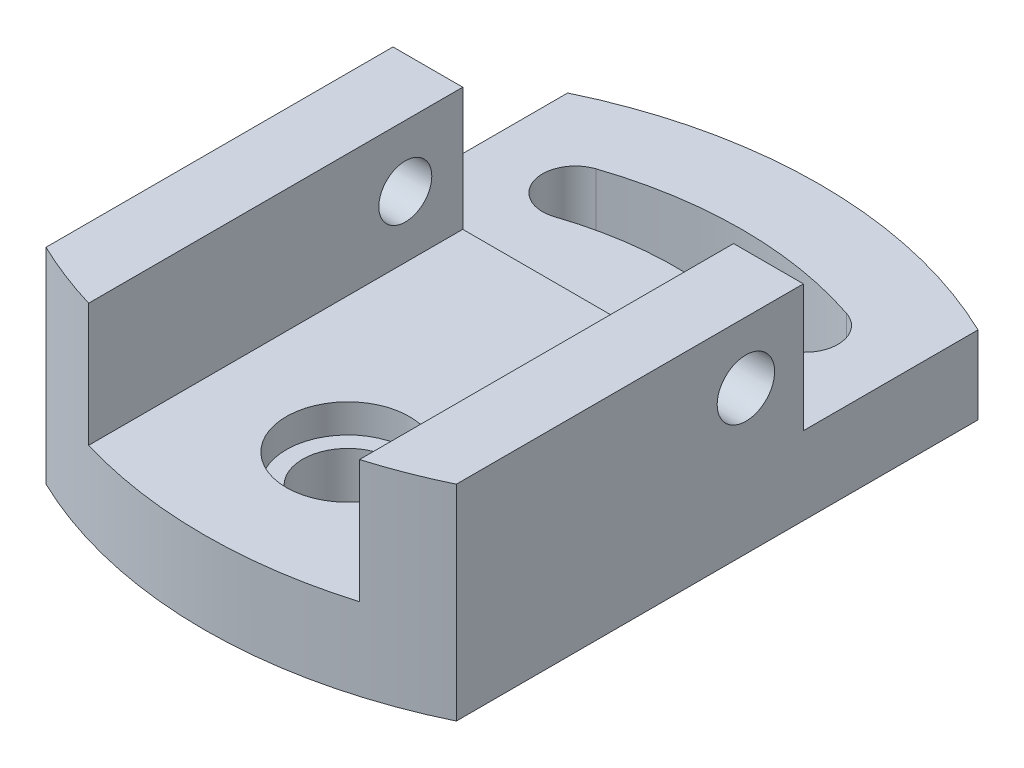
ISO-10303-21;
HEADER;
FILE_DESCRIPTION(('STEP AP214'),'2;1');
FILE_NAME('part.step','',(''),(''),'','','');
FILE_SCHEMA(('AUTOMOTIVE_DESIGN { 1 0 10303 214 1 1 1 1 }'));
ENDSEC;
DATA;
#1=APPLICATION_CONTEXT('core data for automotive mechanical design processes');
#2=APPLICATION_PROTOCOL_DEFINITION('international standard','automotive_design',2000,#1);
#3=PRODUCT_CONTEXT('',#1,'mechanical');
#4=PRODUCT('Part','Part','',(#3));
#5=PRODUCT_RELATED_PRODUCT_CATEGORY('part','',(#4));
#6=PRODUCT_DEFINITION_FORMATION('','',#4);
#7=PRODUCT_DEFINITION_CONTEXT('part definition',#1,'design');
#8=PRODUCT_DEFINITION('design','',#6,#7);
#9=PRODUCT_DEFINITION_SHAPE('','',#8);
#10=(LENGTH_UNIT() NAMED_UNIT(*) SI_UNIT(.MILLI.,.METRE.));
#11=(NAMED_UNIT(*) PLANE_ANGLE_UNIT() SI_UNIT($,.RADIAN.));
#12=(NAMED_UNIT(*) SI_UNIT($,.STERADIAN.) SOLID_ANGLE_UNIT());
#13=UNCERTAINTY_MEASURE_WITH_UNIT(LENGTH_MEASURE(1.E-05),#10,'distance_accuracy_value','');
#14=(GEOMETRIC_REPRESENTATION_CONTEXT(3) GLOBAL_UNCERTAINTY_ASSIGNED_CONTEXT((#13)) GLOBAL_UNIT_ASSIGNED_CONTEXT((#10,
#11,#12)) REPRESENTATION_CONTEXT('',''));
#15=CARTESIAN_POINT('',(0.,0.,0.));
#16=DIRECTION('',(0.,0.,1.));
#17=DIRECTION('',(1.,0.,0.));
#18=AXIS2_PLACEMENT_3D('',#15,#16,#17);
#19=CARTESIAN_POINT('',(-50.,50.,0.));
#20=DIRECTION('',(1.,0.,0.));
#21=DIRECTION('',(0.,0.,-1.));
#22=AXIS2_PLACEMENT_3D('',#19,#20,#21);
#23=PLANE('',#22);
#24=CARTESIAN_POINT('',(-50.,35.,-47.));
#25=DIRECTION('',(-1.,0.,0.));
#26=DIRECTION('',(0.,0.,1.));
#27=AXIS2_PLACEMENT_3D('',#24,#25,#26);
#28=CIRCLE('',#27,6.34);
#29=CARTESIAN_POINT('',(-50.,35.,-40.66));
#30=VERTEX_POINT('',#29);
#31=EDGE_CURVE('E307',#30,#30,#28,.T.);
#32=ORIENTED_EDGE('',*,*,#31,.F.);
#33=EDGE_LOOP('',(#32));
#34=FACE_BOUND('',#33,.T.);
#35=DIRECTION('',(0.,0.,1.));
#36=VECTOR('',#35,1.);
#37=CARTESIAN_POINT('',(-50.,0.,0.));
#38=LINE('',#37,#36);
#39=CARTESIAN_POINT('',(-50.,0.,-103.56157588604));
#40=VERTEX_POINT('',#39);
#41=CARTESIAN_POINT('',(-50.,0.,23.5615758860399));
#42=VERTEX_POINT('',#41);
#43=EDGE_CURVE('E242',#40,#42,#38,.T.);
#44=ORIENTED_EDGE('',*,*,#43,.T.);
#45=DIRECTION('',(0.,-1.,0.));
#46=VECTOR('',#45,1.);
#47=CARTESIAN_POINT('',(-50.,50.,23.5615758860399));
#48=LINE('',#47,#46);
#49=CARTESIAN_POINT('',(-50.,50.,23.5615758860399));
#50=VERTEX_POINT('',#49);
#51=EDGE_CURVE('E47',#50,#42,#48,.T.);
#52=ORIENTED_EDGE('',*,*,#51,.F.);
#53=DIRECTION('',(0.,0.,1.));
#54=VECTOR('',#53,1.);
#55=CARTESIAN_POINT('',(-50.,50.,0.));
#56=LINE('',#55,#54);
#57=CARTESIAN_POINT('',(-50.,50.,-61.));
#58=VERTEX_POINT('',#57);
#59=EDGE_CURVE('E243',#58,#50,#56,.T.);
#60=ORIENTED_EDGE('',*,*,#59,.F.);
#61=DIRECTION('',(0.,-1.,0.));
#62=VECTOR('',#61,1.);
#63=CARTESIAN_POINT('',(-50.,50.,-61.));
#64=LINE('',#63,#62);
#65=CARTESIAN_POINT('',(-50.,19.,-61.));
#66=VERTEX_POINT('',#65);
#67=EDGE_CURVE('E157',#58,#66,#64,.T.);
#68=ORIENTED_EDGE('',*,*,#67,.T.);
#69=DIRECTION('',(0.,0.,1.));
#70=VECTOR('',#69,1.);
#71=CARTESIAN_POINT('',(-50.,19.,0.));
#72=LINE('',#71,#70);
#73=CARTESIAN_POINT('',(-50.,19.,-103.56157588604));
#74=VERTEX_POINT('',#73);
#75=EDGE_CURVE('E54',#74,#66,#72,.T.);
#76=ORIENTED_EDGE('',*,*,#75,.F.);
#77=DIRECTION('',(0.,-1.,0.));
#78=VECTOR('',#77,1.);
#79=CARTESIAN_POINT('',(-50.,19.,-103.56157588604));
#80=LINE('',#79,#78);
#81=EDGE_CURVE('E142',#74,#40,#80,.T.);
#82=ORIENTED_EDGE('',*,*,#81,.T.);
#83=EDGE_LOOP('',(#44,#52,#60,#68,#76,#82));
#84=FACE_BOUND('',#83,.T.);
#85=ADVANCED_FACE('F40',(#34,#84),#23,.F.);
#86=CARTESIAN_POINT('',(0.,50.,-80.));
#87=DIRECTION('',(0.,-1.,0.));
#88=DIRECTION('',(0.,0.,-1.));
#89=AXIS2_PLACEMENT_3D('',#86,#87,#88);
#90=CYLINDRICAL_SURFACE('',#89,115.);
#91=CARTESIAN_POINT('',(0.,0.,-80.));
#92=DIRECTION('',(0.,1.,0.));
#93=DIRECTION('',(0.,0.,1.));
#94=AXIS2_PLACEMENT_3D('',#91,#92,#93);
#95=CIRCLE('',#94,115.);
#96=CARTESIAN_POINT('',(50.,0.,23.5615758860399));
#97=VERTEX_POINT('',#96);
#98=EDGE_CURVE('E247',#42,#97,#95,.T.);
#99=ORIENTED_EDGE('',*,*,#98,.T.);
#100=DIRECTION('',(0.,-1.,0.));
#101=VECTOR('',#100,1.);
#102=CARTESIAN_POINT('',(50.,50.,23.5615758860399));
#103=LINE('',#102,#101);
#104=CARTESIAN_POINT('',(50.,50.,23.5615758860399));
#105=VERTEX_POINT('',#104);
#106=EDGE_CURVE('E224',#105,#97,#103,.T.);
#107=ORIENTED_EDGE('',*,*,#106,.F.);
#108=CARTESIAN_POINT('',(0.,50.,-80.));
#109=DIRECTION('',(0.,1.,0.));
#110=DIRECTION('',(0.,0.,1.));
#111=AXIS2_PLACEMENT_3D('',#108,#109,#110);
#112=CIRCLE('',#111,115.);
#113=CARTESIAN_POINT('',(33.,50.,30.1635148313633));
#114=VERTEX_POINT('',#113);
#115=EDGE_CURVE('E208',#114,#105,#112,.T.);
#116=ORIENTED_EDGE('',*,*,#115,.F.);
#117=DIRECTION('',(0.,-1.,0.));
#118=VECTOR('',#117,1.);
#119=CARTESIAN_POINT('',(33.,50.,30.1635148313633));
#120=LINE('',#119,#118);
#121=CARTESIAN_POINT('',(33.,20.,30.1635148313633));
#122=VERTEX_POINT('',#121);
#123=EDGE_CURVE('E227',#114,#122,#120,.T.);
#124=ORIENTED_EDGE('',*,*,#123,.T.);
#125=CARTESIAN_POINT('',(0.,20.,-80.));
#126=DIRECTION('',(0.,1.,0.));
#127=DIRECTION('',(0.,0.,1.));
#128=AXIS2_PLACEMENT_3D('',#125,#126,#127);
#129=CIRCLE('',#128,115.);
#130=CARTESIAN_POINT('',(-33.,20.,30.1635148313633));
#131=VERTEX_POINT('',#130);
#132=EDGE_CURVE('E234',#131,#122,#129,.T.);
#133=ORIENTED_EDGE('',*,*,#132,.F.);
#134=DIRECTION('',(0.,-1.,0.));
#135=VECTOR('',#134,1.);
#136=CARTESIAN_POINT('',(-33.,50.,30.1635148313633));
#137=LINE('',#136,#135);
#138=CARTESIAN_POINT('',(-33.,50.,30.1635148313633));
#139=VERTEX_POINT('',#138);
#140=EDGE_CURVE('E259',#139,#131,#137,.T.);
#141=ORIENTED_EDGE('',*,*,#140,.F.);
#142=CARTESIAN_POINT('',(0.,50.,-80.));
#143=DIRECTION('',(0.,1.,0.));
#144=DIRECTION('',(0.,0.,1.));
#145=AXIS2_PLACEMENT_3D('',#142,#143,#144);
#146=CIRCLE('',#145,115.);
#147=EDGE_CURVE('E246',#50,#139,#146,.T.);
#148=ORIENTED_EDGE('',*,*,#147,.F.);
#149=ORIENTED_EDGE('',*,*,#51,.T.);
#150=EDGE_LOOP('',(#99,#107,#116,#124,#133,#141,#148,#149));
#151=FACE_BOUND('',#150,.T.);
#152=ADVANCED_FACE('F263',(#151),#90,.T.);
#153=CARTESIAN_POINT('',(-33.,50.,0.));
#154=DIRECTION('',(1.,0.,0.));
#155=DIRECTION('',(0.,0.,-1.));
#156=AXIS2_PLACEMENT_3D('',#153,#154,#155);
#157=PLANE('',#156);
#158=CARTESIAN_POINT('',(-33.,35.,-47.));
#159=DIRECTION('',(1.,0.,0.));
#160=DIRECTION('',(0.,0.,-1.));
#161=AXIS2_PLACEMENT_3D('',#158,#159,#160);
#162=CIRCLE('',#161,6.4522);
#163=CARTESIAN_POINT('',(-33.,35.,-53.4522));
#164=VERTEX_POINT('',#163);
#165=EDGE_CURVE('E313',#164,#164,#162,.F.);
#166=ORIENTED_EDGE('',*,*,#165,.T.);
#167=EDGE_LOOP('',(#166));
#168=FACE_BOUND('',#167,.T.);
#169=DIRECTION('',(0.,0.,1.));
#170=VECTOR('',#169,1.);
#171=CARTESIAN_POINT('',(-33.,20.,0.));
#172=LINE('',#171,#170);
#173=CARTESIAN_POINT('',(-33.,20.,-61.));
#174=VERTEX_POINT('',#173);
#175=EDGE_CURVE('E62',#174,#131,#172,.T.);
#176=ORIENTED_EDGE('',*,*,#175,.F.);
#177=DIRECTION('',(0.,-1.,0.));
#178=VECTOR('',#177,1.);
#179=CARTESIAN_POINT('',(-33.,50.,-61.));
#180=LINE('',#179,#178);
#181=CARTESIAN_POINT('',(-33.,50.,-61.));
#182=VERTEX_POINT('',#181);
#183=EDGE_CURVE('E257',#182,#174,#180,.T.);
#184=ORIENTED_EDGE('',*,*,#183,.F.);
#185=DIRECTION('',(0.,0.,1.));
#186=VECTOR('',#185,1.);
#187=CARTESIAN_POINT('',(-33.,50.,0.));
#188=LINE('',#187,#186);
#189=EDGE_CURVE('E249',#182,#139,#188,.T.);
#190=ORIENTED_EDGE('',*,*,#189,.T.);
#191=ORIENTED_EDGE('',*,*,#140,.T.);
#192=EDGE_LOOP('',(#176,#184,#190,#191));
#193=FACE_BOUND('',#192,.T.);
#194=ADVANCED_FACE('F287',(#168,#193),#157,.T.);
#195=CARTESIAN_POINT('',(0.,50.,-61.));
#196=DIRECTION('',(0.,0.,1.));
#197=DIRECTION('',(1.,0.,0.));
#198=AXIS2_PLACEMENT_3D('',#195,#196,#197);
#199=PLANE('',#198);
#200=DIRECTION('',(0.,-1.,0.));
#201=VECTOR('',#200,1.);
#202=CARTESIAN_POINT('',(50.,50.,-61.));
#203=LINE('',#202,#201);
#204=CARTESIAN_POINT('',(50.,50.,-61.));
#205=VERTEX_POINT('',#204);
#206=CARTESIAN_POINT('',(50.,19.,-61.));
#207=VERTEX_POINT('',#206);
#208=EDGE_CURVE('E221',#205,#207,#203,.T.);
#209=ORIENTED_EDGE('',*,*,#208,.T.);
#210=DIRECTION('',(-1.,0.,0.));
#211=VECTOR('',#210,1.);
#212=CARTESIAN_POINT('',(0.,19.,-61.));
#213=LINE('',#212,#211);
#214=EDGE_CURVE('E158',#207,#66,#213,.T.);
#215=ORIENTED_EDGE('',*,*,#214,.T.);
#216=ORIENTED_EDGE('',*,*,#67,.F.);
#217=DIRECTION('',(-1.,0.,0.));
#218=VECTOR('',#217,1.);
#219=CARTESIAN_POINT('',(0.,50.,-61.));
#220=LINE('',#219,#218);
#221=EDGE_CURVE('E252',#182,#58,#220,.T.);
#222=ORIENTED_EDGE('',*,*,#221,.F.);
#223=ORIENTED_EDGE('',*,*,#183,.T.);
#224=DIRECTION('',(1.,0.,0.));
#225=VECTOR('',#224,1.);
#226=CARTESIAN_POINT('',(0.,20.,-61.));
#227=LINE('',#226,#225);
#228=CARTESIAN_POINT('',(33.,20.,-61.));
#229=VERTEX_POINT('',#228);
#230=EDGE_CURVE('E239',#174,#229,#227,.T.);
#231=ORIENTED_EDGE('',*,*,#230,.T.);
#232=DIRECTION('',(0.,-1.,0.));
#233=VECTOR('',#232,1.);
#234=CARTESIAN_POINT('',(33.,50.,-61.));
#235=LINE('',#234,#233);
#236=CARTESIAN_POINT('',(33.,50.,-61.));
#237=VERTEX_POINT('',#236);
#238=EDGE_CURVE('E216',#237,#229,#235,.T.);
#239=ORIENTED_EDGE('',*,*,#238,.F.);
#240=DIRECTION('',(1.,0.,0.));
#241=VECTOR('',#240,1.);
#242=CARTESIAN_POINT('',(0.,50.,-61.));
#243=LINE('',#242,#241);
#244=EDGE_CURVE('E213',#237,#205,#243,.T.);
#245=ORIENTED_EDGE('',*,*,#244,.T.);
#246=EDGE_LOOP('',(#209,#215,#216,#222,#223,#231,#239,#245));
#247=FACE_BOUND('',#246,.T.);
#248=ADVANCED_FACE('F284',(#247),#199,.F.);
#249=CARTESIAN_POINT('',(0.,50.,0.));
#250=DIRECTION('',(0.,1.,0.));
#251=DIRECTION('',(0.,0.,1.));
#252=AXIS2_PLACEMENT_3D('',#249,#250,#251);
#253=PLANE('',#252);
#254=ORIENTED_EDGE('',*,*,#59,.T.);
#255=ORIENTED_EDGE('',*,*,#147,.T.);
#256=ORIENTED_EDGE('',*,*,#189,.F.);
#257=ORIENTED_EDGE('',*,*,#221,.T.);
#258=EDGE_LOOP('',(#254,#255,#256,#257));
#259=FACE_BOUND('',#258,.T.);
#260=ADVANCED_FACE('F289',(#259),#253,.T.);
#261=CARTESIAN_POINT('',(0.,0.,0.));
#262=DIRECTION('',(0.,1.,0.));
#263=DIRECTION('',(0.,0.,1.));
#264=AXIS2_PLACEMENT_3D('',#261,#262,#263);
#265=PLANE('',#264);
#266=ORIENTED_EDGE('',*,*,#43,.F.);
#267=CARTESIAN_POINT('',(0.,0.,0.));
#268=DIRECTION('',(0.,1.,0.));
#269=DIRECTION('',(0.,0.,1.));
#270=AXIS2_PLACEMENT_3D('',#267,#268,#269);
#271=CIRCLE('',#270,115.);
#272=CARTESIAN_POINT('',(50.,0.,-103.56157588604));
#273=VERTEX_POINT('',#272);
#274=EDGE_CURVE('E148',#40,#273,#271,.F.);
#275=ORIENTED_EDGE('',*,*,#274,.T.);
#276=DIRECTION('',(0.,0.,1.));
#277=VECTOR('',#276,1.);
#278=CARTESIAN_POINT('',(50.,0.,0.));
#279=LINE('',#278,#277);
#280=EDGE_CURVE('E203',#273,#97,#279,.T.);
#281=ORIENTED_EDGE('',*,*,#280,.T.);
#282=ORIENTED_EDGE('',*,*,#98,.F.);
#283=EDGE_LOOP('',(#266,#275,#281,#282));
#284=FACE_BOUND('',#283,.T.);
#285=CARTESIAN_POINT('',(-28.,0.,-83.4266144584568));
#286=DIRECTION('',(0.,1.,0.));
#287=DIRECTION('',(0.,0.,1.));
#288=AXIS2_PLACEMENT_3D('',#285,#286,#287);
#289=CIRCLE('',#288,8.00000000000002);
#290=CARTESIAN_POINT('',(-30.5454545454545,0.,-91.0108521364984));
#291=VERTEX_POINT('',#290);
#292=CARTESIAN_POINT('',(-25.4545454545454,0.,-75.8423767804153));
#293=VERTEX_POINT('',#292);
#294=EDGE_CURVE('E187',#291,#293,#289,.T.);
#295=ORIENTED_EDGE('',*,*,#294,.T.);
#296=CARTESIAN_POINT('',(0.,0.,3.05311331771918E-13));
#297=DIRECTION('',(0.,1.,0.));
#298=DIRECTION('',(0.,0.,1.));
#299=AXIS2_PLACEMENT_3D('',#296,#297,#298);
#300=CIRCLE('',#299,80.0000000000003);
#301=CARTESIAN_POINT('',(25.4545454545455,0.,-75.8423767804153));
#302=VERTEX_POINT('',#301);
#303=EDGE_CURVE('E164',#302,#293,#300,.T.);
#304=ORIENTED_EDGE('',*,*,#303,.F.);
#305=CARTESIAN_POINT('',(28.,0.,-83.4266144584568));
#306=DIRECTION('',(0.,1.,0.));
#307=DIRECTION('',(0.,0.,1.));
#308=AXIS2_PLACEMENT_3D('',#305,#306,#307);
#309=CIRCLE('',#308,8.00000000000002);
#310=CARTESIAN_POINT('',(30.5454545454546,0.,-91.0108521364984));
#311=VERTEX_POINT('',#310);
#312=EDGE_CURVE('E167',#302,#311,#309,.T.);
#313=ORIENTED_EDGE('',*,*,#312,.T.);
#314=CARTESIAN_POINT('',(0.,0.,3.05311331771918E-13));
#315=DIRECTION('',(0.,1.,0.));
#316=DIRECTION('',(0.,0.,1.));
#317=AXIS2_PLACEMENT_3D('',#314,#315,#316);
#318=CIRCLE('',#317,96.0000000000003);
#319=EDGE_CURVE('E191',#311,#291,#318,.T.);
#320=ORIENTED_EDGE('',*,*,#319,.T.);
#321=EDGE_LOOP('',(#295,#304,#313,#320));
#322=FACE_BOUND('',#321,.T.);
#323=CARTESIAN_POINT('',(0.,0.,0.));
#324=DIRECTION('',(0.,1.,0.));
#325=DIRECTION('',(0.,0.,1.));
#326=AXIS2_PLACEMENT_3D('',#323,#324,#325);
#327=CIRCLE('',#326,11.);
#328=CARTESIAN_POINT('',(0.,0.,-11.));
#329=VERTEX_POINT('',#328);
#330=EDGE_CURVE('E170',#329,#329,#327,.T.);
#331=ORIENTED_EDGE('',*,*,#330,.T.);
#332=EDGE_LOOP('',(#331));
#333=FACE_BOUND('',#332,.T.);
#334=ADVANCED_FACE('F267',(#284,#322,#333),#265,.F.);
#335=CARTESIAN_POINT('',(0.,20.,0.));
#336=DIRECTION('',(0.,-1.,0.));
#337=DIRECTION('',(0.,0.,-1.));
#338=AXIS2_PLACEMENT_3D('',#335,#336,#337);
#339=CYLINDRICAL_SURFACE('',#338,15.);
#340=CARTESIAN_POINT('',(0.,13.,0.));
#341=DIRECTION('',(0.,1.,0.));
#342=DIRECTION('',(0.,0.,1.));
#343=AXIS2_PLACEMENT_3D('',#340,#341,#342);
#344=CIRCLE('',#343,15.);
#345=CARTESIAN_POINT('',(0.,13.,15.));
#346=VERTEX_POINT('',#345);
#347=EDGE_CURVE('E11',#346,#346,#344,.T.);
#348=ORIENTED_EDGE('',*,*,#347,.F.);
#349=EDGE_LOOP('',(#348));
#350=FACE_BOUND('',#349,.T.);
#351=CARTESIAN_POINT('',(0.,20.,0.));
#352=DIRECTION('',(0.,1.,0.));
#353=DIRECTION('',(0.,0.,1.));
#354=AXIS2_PLACEMENT_3D('',#351,#352,#353);
#355=CIRCLE('',#354,15.);
#356=CARTESIAN_POINT('',(0.,20.,15.));
#357=VERTEX_POINT('',#356);
#358=EDGE_CURVE('E230',#357,#357,#355,.T.);
#359=ORIENTED_EDGE('',*,*,#358,.T.);
#360=EDGE_LOOP('',(#359));
#361=FACE_BOUND('',#360,.T.);
#362=ADVANCED_FACE('F296',(#350,#361),#339,.F.);
#363=CARTESIAN_POINT('',(0.,20.,0.));
#364=DIRECTION('',(0.,1.,0.));
#365=DIRECTION('',(0.,0.,1.));
#366=AXIS2_PLACEMENT_3D('',#363,#364,#365);
#367=PLANE('',#366);
#368=ORIENTED_EDGE('',*,*,#358,.F.);
#369=EDGE_LOOP('',(#368));
#370=FACE_BOUND('',#369,.T.);
#371=ORIENTED_EDGE('',*,*,#175,.T.);
#372=ORIENTED_EDGE('',*,*,#132,.T.);
#373=DIRECTION('',(0.,0.,1.));
#374=VECTOR('',#373,1.);
#375=CARTESIAN_POINT('',(33.,20.,0.));
#376=LINE('',#375,#374);
#377=EDGE_CURVE('E236',#229,#122,#376,.T.);
#378=ORIENTED_EDGE('',*,*,#377,.F.);
#379=ORIENTED_EDGE('',*,*,#230,.F.);
#380=EDGE_LOOP('',(#371,#372,#378,#379));
#381=FACE_BOUND('',#380,.T.);
#382=ADVANCED_FACE('F282',(#370,#381),#367,.T.);
#383=CARTESIAN_POINT('',(33.,50.,0.));
#384=DIRECTION('',(1.,0.,0.));
#385=DIRECTION('',(0.,0.,-1.));
#386=AXIS2_PLACEMENT_3D('',#383,#384,#385);
#387=PLANE('',#386);
#388=CARTESIAN_POINT('',(33.,35.,-47.));
#389=DIRECTION('',(1.,0.,0.));
#390=DIRECTION('',(0.,0.,-1.));
#391=AXIS2_PLACEMENT_3D('',#388,#389,#390);
#392=CIRCLE('',#391,6.8878);
#393=CARTESIAN_POINT('',(33.,35.,-53.8878));
#394=VERTEX_POINT('',#393);
#395=EDGE_CURVE('E309',#394,#394,#392,.F.);
#396=ORIENTED_EDGE('',*,*,#395,.F.);
#397=EDGE_LOOP('',(#396));
#398=FACE_BOUND('',#397,.T.);
#399=ORIENTED_EDGE('',*,*,#238,.T.);
#400=ORIENTED_EDGE('',*,*,#377,.T.);
#401=ORIENTED_EDGE('',*,*,#123,.F.);
#402=DIRECTION('',(0.,0.,1.));
#403=VECTOR('',#402,1.);
#404=CARTESIAN_POINT('',(33.,50.,0.));
#405=LINE('',#404,#403);
#406=EDGE_CURVE('E205',#237,#114,#405,.T.);
#407=ORIENTED_EDGE('',*,*,#406,.F.);
#408=EDGE_LOOP('',(#399,#400,#401,#407));
#409=FACE_BOUND('',#408,.T.);
#410=ADVANCED_FACE('F279',(#398,#409),#387,.F.);
#411=CARTESIAN_POINT('',(50.,50.,0.));
#412=DIRECTION('',(1.,0.,0.));
#413=DIRECTION('',(0.,0.,-1.));
#414=AXIS2_PLACEMENT_3D('',#411,#412,#413);
#415=PLANE('',#414);
#416=CARTESIAN_POINT('',(50.,35.,-47.));
#417=DIRECTION('',(-1.,0.,0.));
#418=DIRECTION('',(0.,0.,1.));
#419=AXIS2_PLACEMENT_3D('',#416,#417,#418);
#420=CIRCLE('',#419,7.);
#421=CARTESIAN_POINT('',(50.,35.,-40.));
#422=VERTEX_POINT('',#421);
#423=EDGE_CURVE('E310',#422,#422,#420,.T.);
#424=ORIENTED_EDGE('',*,*,#423,.T.);
#425=EDGE_LOOP('',(#424));
#426=FACE_BOUND('',#425,.T.);
#427=ORIENTED_EDGE('',*,*,#280,.F.);
#428=DIRECTION('',(0.,-1.,0.));
#429=VECTOR('',#428,1.);
#430=CARTESIAN_POINT('',(50.,19.,-103.56157588604));
#431=LINE('',#430,#429);
#432=CARTESIAN_POINT('',(50.,19.,-103.56157588604));
#433=VERTEX_POINT('',#432);
#434=EDGE_CURVE('E152',#433,#273,#431,.T.);
#435=ORIENTED_EDGE('',*,*,#434,.F.);
#436=DIRECTION('',(0.,0.,1.));
#437=VECTOR('',#436,1.);
#438=CARTESIAN_POINT('',(50.,19.,0.));
#439=LINE('',#438,#437);
#440=EDGE_CURVE('E163',#433,#207,#439,.T.);
#441=ORIENTED_EDGE('',*,*,#440,.T.);
#442=ORIENTED_EDGE('',*,*,#208,.F.);
#443=DIRECTION('',(0.,0.,1.));
#444=VECTOR('',#443,1.);
#445=CARTESIAN_POINT('',(50.,50.,0.));
#446=LINE('',#445,#444);
#447=EDGE_CURVE('E210',#205,#105,#446,.T.);
#448=ORIENTED_EDGE('',*,*,#447,.T.);
#449=ORIENTED_EDGE('',*,*,#106,.T.);
#450=EDGE_LOOP('',(#427,#435,#441,#442,#448,#449));
#451=FACE_BOUND('',#450,.T.);
#452=ADVANCED_FACE('F270',(#426,#451),#415,.T.);
#453=CARTESIAN_POINT('',(0.,50.,0.));
#454=DIRECTION('',(0.,1.,0.));
#455=DIRECTION('',(0.,0.,1.));
#456=AXIS2_PLACEMENT_3D('',#453,#454,#455);
#457=PLANE('',#456);
#458=ORIENTED_EDGE('',*,*,#406,.T.);
#459=ORIENTED_EDGE('',*,*,#115,.T.);
#460=ORIENTED_EDGE('',*,*,#447,.F.);
#461=ORIENTED_EDGE('',*,*,#244,.F.);
#462=EDGE_LOOP('',(#458,#459,#460,#461));
#463=FACE_BOUND('',#462,.T.);
#464=ADVANCED_FACE('F277',(#463),#457,.T.);
#465=CARTESIAN_POINT('',(-28.,19.,-83.4266144584568));
#466=DIRECTION('',(0.,-1.,0.));
#467=DIRECTION('',(0.,0.,-1.));
#468=AXIS2_PLACEMENT_3D('',#465,#466,#467);
#469=CYLINDRICAL_SURFACE('',#468,8.00000000000002);
#470=ORIENTED_EDGE('',*,*,#294,.F.);
#471=DIRECTION('',(0.,-1.,0.));
#472=VECTOR('',#471,1.);
#473=CARTESIAN_POINT('',(-30.5454545454545,19.,-91.0108521364984));
#474=LINE('',#473,#472);
#475=CARTESIAN_POINT('',(-30.5454545454545,19.,-91.0108521364984));
#476=VERTEX_POINT('',#475);
#477=EDGE_CURVE('E201',#476,#291,#474,.T.);
#478=ORIENTED_EDGE('',*,*,#477,.F.);
#479=CARTESIAN_POINT('',(-28.,19.,-83.4266144584568));
#480=DIRECTION('',(0.,1.,0.));
#481=DIRECTION('',(0.,0.,1.));
#482=AXIS2_PLACEMENT_3D('',#479,#480,#481);
#483=CIRCLE('',#482,8.00000000000002);
#484=CARTESIAN_POINT('',(-25.4545454545454,19.,-75.8423767804153));
#485=VERTEX_POINT('',#484);
#486=EDGE_CURVE('E175',#476,#485,#483,.T.);
#487=ORIENTED_EDGE('',*,*,#486,.T.);
#488=DIRECTION('',(0.,-1.,0.));
#489=VECTOR('',#488,1.);
#490=CARTESIAN_POINT('',(-25.4545454545454,19.,-75.8423767804153));
#491=LINE('',#490,#489);
#492=EDGE_CURVE('E151',#485,#293,#491,.T.);
#493=ORIENTED_EDGE('',*,*,#492,.T.);
#494=EDGE_LOOP('',(#470,#478,#487,#493));
#495=FACE_BOUND('',#494,.T.);
#496=ADVANCED_FACE('F351',(#495),#469,.F.);
#497=CARTESIAN_POINT('',(0.,19.,3.05311331771918E-13));
#498=DIRECTION('',(0.,-1.,0.));
#499=DIRECTION('',(0.,0.,-1.));
#500=AXIS2_PLACEMENT_3D('',#497,#498,#499);
#501=CYLINDRICAL_SURFACE('',#500,96.0000000000003);
#502=ORIENTED_EDGE('',*,*,#319,.F.);
#503=DIRECTION('',(0.,-1.,0.));
#504=VECTOR('',#503,1.);
#505=CARTESIAN_POINT('',(30.5454545454546,19.,-91.0108521364984));
#506=LINE('',#505,#504);
#507=CARTESIAN_POINT('',(30.5454545454546,19.,-91.0108521364984));
#508=VERTEX_POINT('',#507);
#509=EDGE_CURVE('E199',#508,#311,#506,.T.);
#510=ORIENTED_EDGE('',*,*,#509,.F.);
#511=CARTESIAN_POINT('',(0.,19.,3.05311331771918E-13));
#512=DIRECTION('',(0.,1.,0.));
#513=DIRECTION('',(0.,0.,1.));
#514=AXIS2_PLACEMENT_3D('',#511,#512,#513);
#515=CIRCLE('',#514,96.0000000000003);
#516=EDGE_CURVE('E178',#508,#476,#515,.T.);
#517=ORIENTED_EDGE('',*,*,#516,.T.);
#518=ORIENTED_EDGE('',*,*,#477,.T.);
#519=EDGE_LOOP('',(#502,#510,#517,#518));
#520=FACE_BOUND('',#519,.T.);
#521=ADVANCED_FACE('F347',(#520),#501,.F.);
#522=CARTESIAN_POINT('',(28.,19.,-83.4266144584568));
#523=DIRECTION('',(0.,-1.,0.));
#524=DIRECTION('',(0.,0.,-1.));
#525=AXIS2_PLACEMENT_3D('',#522,#523,#524);
#526=CYLINDRICAL_SURFACE('',#525,8.00000000000002);
#527=ORIENTED_EDGE('',*,*,#312,.F.);
#528=DIRECTION('',(0.,-1.,0.));
#529=VECTOR('',#528,1.);
#530=CARTESIAN_POINT('',(25.4545454545455,19.,-75.8423767804153));
#531=LINE('',#530,#529);
#532=CARTESIAN_POINT('',(25.4545454545455,19.,-75.8423767804153));
#533=VERTEX_POINT('',#532);
#534=EDGE_CURVE('E197',#533,#302,#531,.T.);
#535=ORIENTED_EDGE('',*,*,#534,.F.);
#536=CARTESIAN_POINT('',(28.,19.,-83.4266144584568));
#537=DIRECTION('',(0.,1.,0.));
#538=DIRECTION('',(0.,0.,1.));
#539=AXIS2_PLACEMENT_3D('',#536,#537,#538);
#540=CIRCLE('',#539,8.00000000000002);
#541=EDGE_CURVE('E181',#533,#508,#540,.T.);
#542=ORIENTED_EDGE('',*,*,#541,.T.);
#543=ORIENTED_EDGE('',*,*,#509,.T.);
#544=EDGE_LOOP('',(#527,#535,#542,#543));
#545=FACE_BOUND('',#544,.T.);
#546=ADVANCED_FACE('F344',(#545),#526,.F.);
#547=CARTESIAN_POINT('',(0.,19.,0.));
#548=DIRECTION('',(0.,-1.,0.));
#549=DIRECTION('',(0.,0.,-1.));
#550=AXIS2_PLACEMENT_3D('',#547,#548,#549);
#551=CYLINDRICAL_SURFACE('',#550,115.);
#552=ORIENTED_EDGE('',*,*,#274,.F.);
#553=ORIENTED_EDGE('',*,*,#81,.F.);
#554=CARTESIAN_POINT('',(0.,19.,0.));
#555=DIRECTION('',(0.,1.,0.));
#556=DIRECTION('',(0.,0.,1.));
#557=AXIS2_PLACEMENT_3D('',#554,#555,#556);
#558=CIRCLE('',#557,115.);
#559=EDGE_CURVE('E145',#74,#433,#558,.F.);
#560=ORIENTED_EDGE('',*,*,#559,.T.);
#561=ORIENTED_EDGE('',*,*,#434,.T.);
#562=EDGE_LOOP('',(#552,#553,#560,#561));
#563=FACE_BOUND('',#562,.T.);
#564=ADVANCED_FACE('F143',(#563),#551,.T.);
#565=CARTESIAN_POINT('',(0.,19.,3.05311331771918E-13));
#566=DIRECTION('',(0.,-1.,0.));
#567=DIRECTION('',(0.,0.,-1.));
#568=AXIS2_PLACEMENT_3D('',#565,#566,#567);
#569=CYLINDRICAL_SURFACE('',#568,80.0000000000003);
#570=ORIENTED_EDGE('',*,*,#303,.T.);
#571=ORIENTED_EDGE('',*,*,#492,.F.);
#572=CARTESIAN_POINT('',(0.,19.,3.05311331771918E-13));
#573=DIRECTION('',(0.,1.,0.));
#574=DIRECTION('',(0.,0.,1.));
#575=AXIS2_PLACEMENT_3D('',#572,#573,#574);
#576=CIRCLE('',#575,80.0000000000003);
#577=EDGE_CURVE('E184',#533,#485,#576,.T.);
#578=ORIENTED_EDGE('',*,*,#577,.F.);
#579=ORIENTED_EDGE('',*,*,#534,.T.);
#580=EDGE_LOOP('',(#570,#571,#578,#579));
#581=FACE_BOUND('',#580,.T.);
#582=ADVANCED_FACE('F337',(#581),#569,.T.);
#583=CARTESIAN_POINT('',(0.,19.,0.));
#584=DIRECTION('',(0.,1.,0.));
#585=DIRECTION('',(0.,0.,1.));
#586=AXIS2_PLACEMENT_3D('',#583,#584,#585);
#587=PLANE('',#586);
#588=ORIENTED_EDGE('',*,*,#559,.F.);
#589=ORIENTED_EDGE('',*,*,#75,.T.);
#590=ORIENTED_EDGE('',*,*,#214,.F.);
#591=ORIENTED_EDGE('',*,*,#440,.F.);
#592=EDGE_LOOP('',(#588,#589,#590,#591));
#593=FACE_BOUND('',#592,.T.);
#594=ORIENTED_EDGE('',*,*,#486,.F.);
#595=ORIENTED_EDGE('',*,*,#516,.F.);
#596=ORIENTED_EDGE('',*,*,#541,.F.);
#597=ORIENTED_EDGE('',*,*,#577,.T.);
#598=EDGE_LOOP('',(#594,#595,#596,#597));
#599=FACE_BOUND('',#598,.T.);
#600=ADVANCED_FACE('F160',(#593,#599),#587,.T.);
#601=CARTESIAN_POINT('',(0.,13.,0.));
#602=DIRECTION('',(0.,-1.,0.));
#603=DIRECTION('',(0.,0.,-1.));
#604=AXIS2_PLACEMENT_3D('',#601,#602,#603);
#605=CYLINDRICAL_SURFACE('',#604,11.);
#606=CARTESIAN_POINT('',(0.,13.,0.));
#607=DIRECTION('',(0.,1.,0.));
#608=DIRECTION('',(0.,0.,1.));
#609=AXIS2_PLACEMENT_3D('',#606,#607,#608);
#610=CIRCLE('',#609,11.);
#611=CARTESIAN_POINT('',(0.,13.,-11.));
#612=VERTEX_POINT('',#611);
#613=EDGE_CURVE('E188',#612,#612,#610,.T.);
#614=CARTESIAN_POINT('',(0.,13.,-11.));
#615=CARTESIAN_POINT('',(0.,12.8645833333333,-11.));
#616=CARTESIAN_POINT('',(0.,12.7291666666667,-11.));
#617=CARTESIAN_POINT('',(0.,12.4583333333333,-11.));
#618=CARTESIAN_POINT('',(0.,12.3229166666667,-11.));
#619=CARTESIAN_POINT('',(0.,12.0520833333333,-11.));
#620=CARTESIAN_POINT('',(0.,11.9166666666667,-11.));
#621=CARTESIAN_POINT('',(0.,11.6458333333333,-11.));
#622=CARTESIAN_POINT('',(0.,11.5104166666667,-11.));
#623=CARTESIAN_POINT('',(0.,11.2395833333333,-11.));
#624=CARTESIAN_POINT('',(0.,11.1041666666667,-11.));
#625=CARTESIAN_POINT('',(0.,10.8333333333333,-11.));
#626=CARTESIAN_POINT('',(0.,10.6979166666667,-11.));
#627=CARTESIAN_POINT('',(0.,10.4270833333333,-11.));
#628=CARTESIAN_POINT('',(0.,10.2916666666667,-11.));
#629=CARTESIAN_POINT('',(0.,10.0208333333333,-11.));
#630=CARTESIAN_POINT('',(0.,9.88541666666667,-11.));
#631=CARTESIAN_POINT('',(0.,9.61458333333333,-11.));
#632=CARTESIAN_POINT('',(0.,9.47916666666667,-11.));
#633=CARTESIAN_POINT('',(0.,9.20833333333333,-11.));
#634=CARTESIAN_POINT('',(0.,9.07291666666666,-11.));
#635=CARTESIAN_POINT('',(0.,8.80208333333333,-11.));
#636=CARTESIAN_POINT('',(0.,8.66666666666667,-11.));
#637=CARTESIAN_POINT('',(0.,8.39583333333333,-11.));
#638=CARTESIAN_POINT('',(0.,8.26041666666667,-11.));
#639=CARTESIAN_POINT('',(0.,7.98958333333333,-11.));
#640=CARTESIAN_POINT('',(0.,7.85416666666667,-11.));
#641=CARTESIAN_POINT('',(0.,7.58333333333333,-11.));
#642=CARTESIAN_POINT('',(0.,7.44791666666667,-11.));
#643=CARTESIAN_POINT('',(0.,7.17708333333333,-11.));
#644=CARTESIAN_POINT('',(0.,7.04166666666667,-11.));
#645=CARTESIAN_POINT('',(0.,6.77083333333333,-11.));
#646=CARTESIAN_POINT('',(0.,6.63541666666667,-11.));
#647=CARTESIAN_POINT('',(0.,6.36458333333333,-11.));
#648=CARTESIAN_POINT('',(0.,6.22916666666667,-11.));
#649=CARTESIAN_POINT('',(0.,5.95833333333333,-11.));
#650=CARTESIAN_POINT('',(0.,5.82291666666667,-11.));
#651=CARTESIAN_POINT('',(0.,5.55208333333333,-11.));
#652=CARTESIAN_POINT('',(0.,5.41666666666667,-11.));
#653=CARTESIAN_POINT('',(0.,5.14583333333333,-11.));
#654=CARTESIAN_POINT('',(0.,5.01041666666667,-11.));
#655=CARTESIAN_POINT('',(0.,4.73958333333333,-11.));
#656=CARTESIAN_POINT('',(0.,4.60416666666667,-11.));
#657=CARTESIAN_POINT('',(0.,4.33333333333333,-11.));
#658=CARTESIAN_POINT('',(0.,4.19791666666667,-11.));
#659=CARTESIAN_POINT('',(0.,3.92708333333333,-11.));
#660=CARTESIAN_POINT('',(0.,3.79166666666667,-11.));
#661=CARTESIAN_POINT('',(0.,3.52083333333333,-11.));
#662=CARTESIAN_POINT('',(0.,3.38541666666667,-11.));
#663=CARTESIAN_POINT('',(0.,3.11458333333333,-11.));
#664=CARTESIAN_POINT('',(0.,2.97916666666667,-11.));
#665=CARTESIAN_POINT('',(0.,2.70833333333333,-11.));
#666=CARTESIAN_POINT('',(0.,2.57291666666667,-11.));
#667=CARTESIAN_POINT('',(0.,2.30208333333333,-11.));
#668=CARTESIAN_POINT('',(0.,2.16666666666667,-11.));
#669=CARTESIAN_POINT('',(0.,1.89583333333333,-11.));
#670=CARTESIAN_POINT('',(0.,1.76041666666667,-11.));
#671=CARTESIAN_POINT('',(0.,1.48958333333333,-11.));
#672=CARTESIAN_POINT('',(0.,1.35416666666667,-11.));
#673=CARTESIAN_POINT('',(0.,1.08333333333333,-11.));
#674=CARTESIAN_POINT('',(0.,0.947916666666667,-11.));
#675=CARTESIAN_POINT('',(0.,0.677083333333334,-11.));
#676=CARTESIAN_POINT('',(0.,0.541666666666667,-11.));
#677=CARTESIAN_POINT('',(0.,0.270833333333334,-11.));
#678=CARTESIAN_POINT('',(0.,0.135416666666667,-11.));
#679=CARTESIAN_POINT('',(0.,0.,-11.));
#680=B_SPLINE_CURVE_WITH_KNOTS('',3,(#614,#615,#616,#617,#618,#619,#620,#621,#622,#623,#624,
#625,#626,#627,#628,#629,#630,#631,#632,#633,#634,#635,#636,#637,#638,#639,#640,#641,#642,#643,
#644,#645,#646,#647,#648,#649,#650,#651,#652,#653,#654,#655,#656,#657,#658,#659,#660,#661,#662,
#663,#664,#665,#666,#667,#668,#669,#670,#671,#672,#673,#674,#675,#676,#677,#678,#679),
.UNSPECIFIED.,.F.,.F.,(4,2,2,2,2,2,2,2,2,2,2,2,2,2,2,2,2,2,2,2,2,2,2,2,2,2,2,2,2,2,2,2,4),(0.,
0.40625,0.812500000000001,1.21875,1.625,2.03125,2.4375,2.84375,3.25,3.65625,4.0625,4.46875,
4.875,5.28125,5.6875,6.09375,6.5,6.90625,7.3125,7.71875,8.125,8.53125,8.9375,9.34375,9.75,
10.15625,10.5625,10.96875,11.375,11.78125,12.1875,12.59375,13.),.UNSPECIFIED.);
#681=EDGE_CURVE('BSEAM326',#612,#329,#680,.T.);
#682=ORIENTED_EDGE('',*,*,#613,.T.);
#683=ORIENTED_EDGE('',*,*,#330,.F.);
#684=ORIENTED_EDGE('',*,*,#681,.T.);
#685=ORIENTED_EDGE('',*,*,#681,.F.);
#686=EDGE_LOOP('',(#682,#684,#683,#685));
#687=FACE_BOUND('',#686,.T.);
#688=ADVANCED_FACE('F326',(#687),#605,.F.);
#689=CARTESIAN_POINT('',(0.,13.,0.));
#690=DIRECTION('',(0.,1.,0.));
#691=DIRECTION('',(0.,0.,1.));
#692=AXIS2_PLACEMENT_3D('',#689,#690,#691);
#693=PLANE('',#692);
#694=ORIENTED_EDGE('',*,*,#613,.F.);
#695=EDGE_LOOP('',(#694));
#696=FACE_BOUND('',#695,.T.);
#697=ORIENTED_EDGE('',*,*,#347,.T.);
#698=EDGE_LOOP('',(#697));
#699=FACE_BOUND('',#698,.T.);
#700=ADVANCED_FACE('F328',(#696,#699),#693,.T.);
#701=CARTESIAN_POINT('',(50.,35.,-47.));
#702=DIRECTION('',(1.,0.,0.));
#703=DIRECTION('',(0.,0.,-1.));
#704=AXIS2_PLACEMENT_3D('',#701,#702,#703);
#705=CONICAL_SURFACE('',#704,7.,0.00659990417050459);
#706=ORIENTED_EDGE('',*,*,#423,.F.);
#707=EDGE_LOOP('',(#706));
#708=FACE_BOUND('',#707,.T.);
#709=ORIENTED_EDGE('',*,*,#395,.T.);
#710=EDGE_LOOP('',(#709));
#711=FACE_BOUND('',#710,.T.);
#712=ADVANCED_FACE('F334',(#708,#711),#705,.F.);
#713=ORIENTED_EDGE('',*,*,#165,.F.);
#714=EDGE_LOOP('',(#713));
#715=FACE_BOUND('',#714,.T.);
#716=ORIENTED_EDGE('',*,*,#31,.T.);
#717=EDGE_LOOP('',(#716));
#718=FACE_BOUND('',#717,.T.);
#719=ADVANCED_FACE('F455',(#715,#718),#705,.F.);
#720=CLOSED_SHELL('',(#85,#152,#194,#248,#260,#334,#362,#382,#410,#452,#464,#496,#521,#546,#564,
#582,#600,#688,#700,#712,#719));
#721=MANIFOLD_SOLID_BREP('B2',#720);
#722=ADVANCED_BREP_SHAPE_REPRESENTATION('',(#18,#721),#14);
#723=SHAPE_DEFINITION_REPRESENTATION(#9,#722);
ENDSEC;
END-ISO-10303-21;
